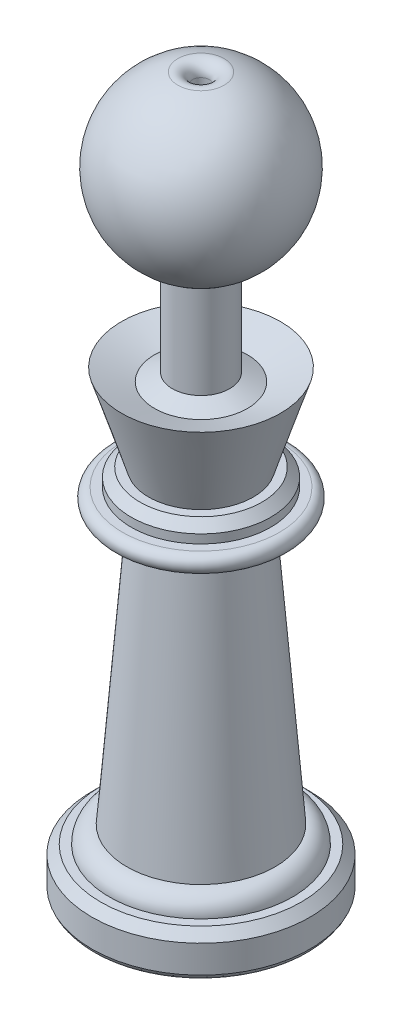
ISO-10303-21;
HEADER;
FILE_DESCRIPTION(('STEP AP214'),'2;1');
FILE_NAME('part.step','',(''),(''),'','','');
FILE_SCHEMA(('AUTOMOTIVE_DESIGN { 1 0 10303 214 1 1 1 1 }'));
ENDSEC;
DATA;
#1=APPLICATION_CONTEXT('core data for automotive mechanical design processes');
#2=APPLICATION_PROTOCOL_DEFINITION('international standard','automotive_design',2000,#1);
#3=PRODUCT_CONTEXT('',#1,'mechanical');
#4=PRODUCT('Part','Part','',(#3));
#5=PRODUCT_RELATED_PRODUCT_CATEGORY('part','',(#4));
#6=PRODUCT_DEFINITION_FORMATION('','',#4);
#7=PRODUCT_DEFINITION_CONTEXT('part definition',#1,'design');
#8=PRODUCT_DEFINITION('design','',#6,#7);
#9=PRODUCT_DEFINITION_SHAPE('','',#8);
#10=(LENGTH_UNIT() NAMED_UNIT(*) SI_UNIT(.MILLI.,.METRE.));
#11=(NAMED_UNIT(*) PLANE_ANGLE_UNIT() SI_UNIT($,.RADIAN.));
#12=(NAMED_UNIT(*) SI_UNIT($,.STERADIAN.) SOLID_ANGLE_UNIT());
#13=UNCERTAINTY_MEASURE_WITH_UNIT(LENGTH_MEASURE(1.E-05),#10,'distance_accuracy_value','');
#14=(GEOMETRIC_REPRESENTATION_CONTEXT(3) GLOBAL_UNCERTAINTY_ASSIGNED_CONTEXT((#13)) GLOBAL_UNIT_ASSIGNED_CONTEXT((#10,
#11,#12)) REPRESENTATION_CONTEXT('',''));
#15=CARTESIAN_POINT('',(0.,0.,0.));
#16=DIRECTION('',(0.,0.,1.));
#17=DIRECTION('',(1.,0.,0.));
#18=AXIS2_PLACEMENT_3D('',#15,#16,#17);
#19=CARTESIAN_POINT('',(0.,62.32,0.));
#20=DIRECTION('',(0.,-1.,0.));
#21=DIRECTION('',(0.,0.,-1.));
#22=AXIS2_PLACEMENT_3D('',#19,#20,#21);
#23=CYLINDRICAL_SURFACE('',#22,0.75);
#24=CARTESIAN_POINT('',(0.,60.6510598246399,0.));
#25=DIRECTION('',(0.,-1.,0.));
#26=DIRECTION('',(0.,0.,-1.));
#27=AXIS2_PLACEMENT_3D('',#24,#25,#26);
#28=CIRCLE('',#27,0.75);
#29=CARTESIAN_POINT('',(0.,60.6510598246399,-0.75));
#30=VERTEX_POINT('',#29);
#31=EDGE_CURVE('E60',#30,#30,#28,.F.);
#32=ORIENTED_EDGE('',*,*,#31,.T.);
#33=EDGE_LOOP('',(#32));
#34=FACE_BOUND('',#33,.T.);
#35=CARTESIAN_POINT('',(0.,1.32,0.));
#36=DIRECTION('',(0.,-1.,0.));
#37=DIRECTION('',(0.,0.,-1.));
#38=AXIS2_PLACEMENT_3D('',#35,#36,#37);
#39=CIRCLE('',#38,0.75);
#40=CARTESIAN_POINT('',(0.,1.32,-0.75));
#41=VERTEX_POINT('',#40);
#42=EDGE_CURVE('E72',#41,#41,#39,.F.);
#43=ORIENTED_EDGE('',*,*,#42,.F.);
#44=EDGE_LOOP('',(#43));
#45=FACE_BOUND('',#44,.T.);
#46=ADVANCED_FACE('F47',(#34,#45),#23,.F.);
#47=CARTESIAN_POINT('',(0.,39.8518731212378,0.));
#48=DIRECTION('',(0.,-1.,0.));
#49=DIRECTION('',(0.,0.,-1.));
#50=AXIS2_PLACEMENT_3D('',#47,#48,#49);
#51=CONICAL_SURFACE('',#50,0.378886856697502,1.14466578861794);
#52=CARTESIAN_POINT('',(0.,38.8890023826898,0.));
#53=DIRECTION('',(0.,-1.,0.));
#54=DIRECTION('',(0.,0.,-1.));
#55=AXIS2_PLACEMENT_3D('',#52,#53,#54);
#56=CIRCLE('',#55,2.5);
#57=CARTESIAN_POINT('',(0.,38.8890023826898,-2.5));
#58=VERTEX_POINT('',#57);
#59=EDGE_CURVE('E78',#58,#58,#56,.T.);
#60=ORIENTED_EDGE('',*,*,#59,.T.);
#61=EDGE_LOOP('',(#60));
#62=FACE_BOUND('',#61,.T.);
#63=CARTESIAN_POINT('',(0.,38.1790309038726,0.));
#64=DIRECTION('',(0.,-1.,0.));
#65=DIRECTION('',(0.,0.,-1.));
#66=AXIS2_PLACEMENT_3D('',#63,#64,#65);
#67=CIRCLE('',#66,4.06400000000001);
#68=CARTESIAN_POINT('',(0.,38.1790309038726,-4.06400000000001));
#69=VERTEX_POINT('',#68);
#70=EDGE_CURVE('E98',#69,#69,#67,.T.);
#71=ORIENTED_EDGE('',*,*,#70,.F.);
#72=EDGE_LOOP('',(#71));
#73=FACE_BOUND('',#72,.T.);
#74=ADVANCED_FACE('F166',(#62,#73),#51,.T.);
#75=CARTESIAN_POINT('',(0.,38.1790309038726,0.));
#76=DIRECTION('',(0.,1.,0.));
#77=DIRECTION('',(0.,0.,1.));
#78=AXIS2_PLACEMENT_3D('',#75,#76,#77);
#79=CONICAL_SURFACE('',#78,4.06400000000001,1.21375917489139);
#80=CARTESIAN_POINT('',(0.,39.2543812972836,0.));
#81=DIRECTION('',(0.,-1.,0.));
#82=DIRECTION('',(0.,0.,-1.));
#83=AXIS2_PLACEMENT_3D('',#80,#81,#82);
#84=CIRCLE('',#83,6.94679152947641);
#85=CARTESIAN_POINT('',(0.,39.2543812972836,-6.94679152947641));
#86=VERTEX_POINT('',#85);
#87=EDGE_CURVE('E102',#86,#86,#84,.T.);
#88=ORIENTED_EDGE('',*,*,#87,.F.);
#89=EDGE_LOOP('',(#88));
#90=FACE_BOUND('',#89,.T.);
#91=ORIENTED_EDGE('',*,*,#70,.T.);
#92=EDGE_LOOP('',(#91));
#93=FACE_BOUND('',#92,.T.);
#94=ADVANCED_FACE('F173',(#90,#93),#79,.F.);
#95=CARTESIAN_POINT('',(0.,39.2543812972836,0.));
#96=DIRECTION('',(0.,1.,0.));
#97=DIRECTION('',(0.,0.,1.));
#98=AXIS2_PLACEMENT_3D('',#95,#96,#97);
#99=CONICAL_SURFACE('',#98,6.94679152947641,0.305512416394749);
#100=CARTESIAN_POINT('',(0.,31.7246,0.));
#101=DIRECTION('',(0.,-1.,0.));
#102=DIRECTION('',(0.,0.,-1.));
#103=AXIS2_PLACEMENT_3D('',#100,#101,#102);
#104=CIRCLE('',#103,4.572);
#105=CARTESIAN_POINT('',(0.,31.7246,-4.572));
#106=VERTEX_POINT('',#105);
#107=EDGE_CURVE('E106',#106,#106,#104,.T.);
#108=ORIENTED_EDGE('',*,*,#107,.F.);
#109=EDGE_LOOP('',(#108));
#110=FACE_BOUND('',#109,.T.);
#111=ORIENTED_EDGE('',*,*,#87,.T.);
#112=EDGE_LOOP('',(#111));
#113=FACE_BOUND('',#112,.T.);
#114=ADVANCED_FACE('F220',(#110,#113),#99,.T.);
#115=CARTESIAN_POINT('',(-6.096,31.7246,0.));
#116=DIRECTION('',(0.,-1.,0.));
#117=DIRECTION('',(0.,0.,-1.));
#118=AXIS2_PLACEMENT_3D('',#115,#116,#117);
#119=PLANE('',#118);
#120=CARTESIAN_POINT('',(0.,31.7246,0.));
#121=DIRECTION('',(0.,-1.,0.));
#122=DIRECTION('',(0.,0.,-1.));
#123=AXIS2_PLACEMENT_3D('',#120,#121,#122);
#124=CIRCLE('',#123,5.334);
#125=CARTESIAN_POINT('',(0.,31.7246,-5.334));
#126=VERTEX_POINT('',#125);
#127=EDGE_CURVE('E71',#126,#126,#124,.F.);
#128=ORIENTED_EDGE('',*,*,#127,.T.);
#129=EDGE_LOOP('',(#128));
#130=FACE_BOUND('',#129,.T.);
#131=ORIENTED_EDGE('',*,*,#107,.T.);
#132=EDGE_LOOP('',(#131));
#133=FACE_BOUND('',#132,.T.);
#134=ADVANCED_FACE('F216',(#130,#133),#119,.F.);
#135=CARTESIAN_POINT('',(0.,0.,0.));
#136=DIRECTION('',(0.,-1.,0.));
#137=DIRECTION('',(0.,0.,-1.));
#138=AXIS2_PLACEMENT_3D('',#135,#136,#137);
#139=CYLINDRICAL_SURFACE('',#138,6.096);
#140=CARTESIAN_POINT('',(0.,30.9626,0.));
#141=DIRECTION('',(0.,-1.,0.));
#142=DIRECTION('',(0.,0.,-1.));
#143=AXIS2_PLACEMENT_3D('',#140,#141,#142);
#144=CIRCLE('',#143,6.096);
#145=CARTESIAN_POINT('',(0.,30.9626,-6.096));
#146=VERTEX_POINT('',#145);
#147=EDGE_CURVE('E86',#146,#146,#144,.T.);
#148=ORIENTED_EDGE('',*,*,#147,.T.);
#149=EDGE_LOOP('',(#148));
#150=FACE_BOUND('',#149,.T.);
#151=CARTESIAN_POINT('',(0.,30.2006,0.));
#152=DIRECTION('',(0.,-1.,0.));
#153=DIRECTION('',(0.,0.,-1.));
#154=AXIS2_PLACEMENT_3D('',#151,#152,#153);
#155=CIRCLE('',#154,6.096);
#156=CARTESIAN_POINT('',(0.,30.2006,-6.096));
#157=VERTEX_POINT('',#156);
#158=EDGE_CURVE('E110',#157,#157,#155,.T.);
#159=ORIENTED_EDGE('',*,*,#158,.F.);
#160=EDGE_LOOP('',(#159));
#161=FACE_BOUND('',#160,.T.);
#162=ADVANCED_FACE('F212',(#150,#161),#139,.T.);
#163=CARTESIAN_POINT('',(-6.858,30.2006,0.));
#164=DIRECTION('',(0.,-1.,0.));
#165=DIRECTION('',(0.,0.,-1.));
#166=AXIS2_PLACEMENT_3D('',#163,#164,#165);
#167=PLANE('',#166);
#168=CARTESIAN_POINT('',(0.,30.2006,0.));
#169=DIRECTION('',(0.,-1.,0.));
#170=DIRECTION('',(0.,0.,-1.));
#171=AXIS2_PLACEMENT_3D('',#168,#169,#170);
#172=CIRCLE('',#171,6.858);
#173=CARTESIAN_POINT('',(0.,30.2006,-6.858));
#174=VERTEX_POINT('',#173);
#175=EDGE_CURVE('E114',#174,#174,#172,.T.);
#176=ORIENTED_EDGE('',*,*,#175,.F.);
#177=EDGE_LOOP('',(#176));
#178=FACE_BOUND('',#177,.T.);
#179=ORIENTED_EDGE('',*,*,#158,.T.);
#180=EDGE_LOOP('',(#179));
#181=FACE_BOUND('',#180,.T.);
#182=ADVANCED_FACE('F208',(#178,#181),#167,.F.);
#183=CARTESIAN_POINT('',(0.,29.4386,0.));
#184=DIRECTION('',(0.,-1.,0.));
#185=DIRECTION('',(0.,0.,-1.));
#186=AXIS2_PLACEMENT_3D('',#183,#184,#185);
#187=TOROIDAL_SURFACE('',#186,6.858,0.761999999999999);
#188=CARTESIAN_POINT('',(0.,28.6766,0.));
#189=DIRECTION('',(0.,-1.,0.));
#190=DIRECTION('',(0.,0.,-1.));
#191=AXIS2_PLACEMENT_3D('',#188,#189,#190);
#192=CIRCLE('',#191,6.858);
#193=CARTESIAN_POINT('',(0.,28.6766,-6.858));
#194=VERTEX_POINT('',#193);
#195=EDGE_CURVE('E118',#194,#194,#192,.T.);
#196=ORIENTED_EDGE('',*,*,#195,.F.);
#197=EDGE_LOOP('',(#196));
#198=FACE_BOUND('',#197,.T.);
#199=ORIENTED_EDGE('',*,*,#175,.T.);
#200=EDGE_LOOP('',(#199));
#201=FACE_BOUND('',#200,.T.);
#202=ADVANCED_FACE('F204',(#198,#201),#187,.T.);
#203=CARTESIAN_POINT('',(-4.572,28.6766,0.));
#204=DIRECTION('',(0.,1.,0.));
#205=DIRECTION('',(0.,0.,1.));
#206=AXIS2_PLACEMENT_3D('',#203,#204,#205);
#207=PLANE('',#206);
#208=CARTESIAN_POINT('',(0.,28.6766,0.));
#209=DIRECTION('',(0.,-1.,0.));
#210=DIRECTION('',(0.,0.,-1.));
#211=AXIS2_PLACEMENT_3D('',#208,#209,#210);
#212=CIRCLE('',#211,4.572);
#213=CARTESIAN_POINT('',(0.,28.6766,-4.572));
#214=VERTEX_POINT('',#213);
#215=EDGE_CURVE('E122',#214,#214,#212,.T.);
#216=ORIENTED_EDGE('',*,*,#215,.F.);
#217=EDGE_LOOP('',(#216));
#218=FACE_BOUND('',#217,.T.);
#219=ORIENTED_EDGE('',*,*,#195,.T.);
#220=EDGE_LOOP('',(#219));
#221=FACE_BOUND('',#220,.T.);
#222=ADVANCED_FACE('F200',(#218,#221),#207,.F.);
#223=CARTESIAN_POINT('',(0.,28.6766,0.));
#224=DIRECTION('',(0.,-1.,0.));
#225=DIRECTION('',(0.,0.,-1.));
#226=AXIS2_PLACEMENT_3D('',#223,#224,#225);
#227=CONICAL_SURFACE('',#226,4.572,0.0792826173458509);
#228=CARTESIAN_POINT('',(0.,4.699,0.));
#229=DIRECTION('',(0.,-1.,0.));
#230=DIRECTION('',(0.,0.,-1.));
#231=AXIS2_PLACEMENT_3D('',#228,#229,#230);
#232=CIRCLE('',#231,6.477);
#233=CARTESIAN_POINT('',(0.,4.699,-6.477));
#234=VERTEX_POINT('',#233);
#235=EDGE_CURVE('E126',#234,#234,#232,.T.);
#236=ORIENTED_EDGE('',*,*,#235,.F.);
#237=EDGE_LOOP('',(#236));
#238=FACE_BOUND('',#237,.T.);
#239=ORIENTED_EDGE('',*,*,#215,.T.);
#240=EDGE_LOOP('',(#239));
#241=FACE_BOUND('',#240,.T.);
#242=ADVANCED_FACE('F196',(#238,#241),#227,.T.);
#243=CARTESIAN_POINT('',(-9.525,3.175,0.));
#244=DIRECTION('',(0.,-1.,0.));
#245=DIRECTION('',(0.,0.,-1.));
#246=AXIS2_PLACEMENT_3D('',#243,#244,#245);
#247=PLANE('',#246);
#248=CARTESIAN_POINT('',(0.,3.175,0.));
#249=DIRECTION('',(0.,-1.,0.));
#250=DIRECTION('',(0.,0.,-1.));
#251=AXIS2_PLACEMENT_3D('',#248,#249,#250);
#252=CIRCLE('',#251,8.763);
#253=CARTESIAN_POINT('',(0.,3.175,-8.763));
#254=VERTEX_POINT('',#253);
#255=EDGE_CURVE('E90',#254,#254,#252,.F.);
#256=ORIENTED_EDGE('',*,*,#255,.T.);
#257=EDGE_LOOP('',(#256));
#258=FACE_BOUND('',#257,.T.);
#259=CARTESIAN_POINT('',(0.,3.175,0.));
#260=DIRECTION('',(0.,-1.,0.));
#261=DIRECTION('',(0.,0.,-1.));
#262=AXIS2_PLACEMENT_3D('',#259,#260,#261);
#263=CIRCLE('',#262,8.001);
#264=CARTESIAN_POINT('',(0.,3.175,-8.001));
#265=VERTEX_POINT('',#264);
#266=EDGE_CURVE('E130',#265,#265,#263,.T.);
#267=ORIENTED_EDGE('',*,*,#266,.T.);
#268=EDGE_LOOP('',(#267));
#269=FACE_BOUND('',#268,.T.);
#270=ADVANCED_FACE('F192',(#258,#269),#247,.F.);
#271=CARTESIAN_POINT('',(0.,0.,0.));
#272=DIRECTION('',(0.,-1.,0.));
#273=DIRECTION('',(0.,0.,-1.));
#274=AXIS2_PLACEMENT_3D('',#271,#272,#273);
#275=CYLINDRICAL_SURFACE('',#274,9.525);
#276=CARTESIAN_POINT('',(0.,2.413,0.));
#277=DIRECTION('',(0.,-1.,0.));
#278=DIRECTION('',(0.,0.,-1.));
#279=AXIS2_PLACEMENT_3D('',#276,#277,#278);
#280=CIRCLE('',#279,9.525);
#281=CARTESIAN_POINT('',(0.,2.413,-9.525));
#282=VERTEX_POINT('',#281);
#283=EDGE_CURVE('E94',#282,#282,#280,.T.);
#284=ORIENTED_EDGE('',*,*,#283,.T.);
#285=EDGE_LOOP('',(#284));
#286=FACE_BOUND('',#285,.T.);
#287=CARTESIAN_POINT('',(0.,0.,0.));
#288=DIRECTION('',(0.,-1.,0.));
#289=DIRECTION('',(0.,0.,-1.));
#290=AXIS2_PLACEMENT_3D('',#287,#288,#289);
#291=CIRCLE('',#290,9.525);
#292=CARTESIAN_POINT('',(0.,0.,-9.525));
#293=VERTEX_POINT('',#292);
#294=EDGE_CURVE('E134',#293,#293,#291,.T.);
#295=ORIENTED_EDGE('',*,*,#294,.F.);
#296=EDGE_LOOP('',(#295));
#297=FACE_BOUND('',#296,.T.);
#298=ADVANCED_FACE('F188',(#286,#297),#275,.T.);
#299=CARTESIAN_POINT('',(0.,3.175,0.));
#300=DIRECTION('',(0.,-1.,0.));
#301=DIRECTION('',(0.,0.,-1.));
#302=AXIS2_PLACEMENT_3D('',#299,#300,#301);
#303=TOROIDAL_SURFACE('',#302,6.477,1.524);
#304=ORIENTED_EDGE('',*,*,#235,.T.);
#305=EDGE_LOOP('',(#304));
#306=FACE_BOUND('',#305,.T.);
#307=ORIENTED_EDGE('',*,*,#266,.F.);
#308=EDGE_LOOP('',(#307));
#309=FACE_BOUND('',#308,.T.);
#310=ADVANCED_FACE('F191',(#306,#309),#303,.T.);
#311=CARTESIAN_POINT('',(0.,2.413,0.));
#312=DIRECTION('',(0.,-1.,0.));
#313=DIRECTION('',(0.,0.,-1.));
#314=AXIS2_PLACEMENT_3D('',#311,#312,#313);
#315=CONICAL_SURFACE('',#314,9.525,0.785398163397451);
#316=ORIENTED_EDGE('',*,*,#255,.F.);
#317=EDGE_LOOP('',(#316));
#318=FACE_BOUND('',#317,.T.);
#319=ORIENTED_EDGE('',*,*,#283,.F.);
#320=EDGE_LOOP('',(#319));
#321=FACE_BOUND('',#320,.T.);
#322=ADVANCED_FACE('F230',(#318,#321),#315,.T.);
#323=CARTESIAN_POINT('',(0.,30.9626,0.));
#324=DIRECTION('',(0.,-1.,0.));
#325=DIRECTION('',(0.,0.,-1.));
#326=AXIS2_PLACEMENT_3D('',#323,#324,#325);
#327=CONICAL_SURFACE('',#326,6.096,0.785398163397449);
#328=ORIENTED_EDGE('',*,*,#127,.F.);
#329=EDGE_LOOP('',(#328));
#330=FACE_BOUND('',#329,.T.);
#331=ORIENTED_EDGE('',*,*,#147,.F.);
#332=EDGE_LOOP('',(#331));
#333=FACE_BOUND('',#332,.T.);
#334=ADVANCED_FACE('F187',(#330,#333),#327,.T.);
#335=CARTESIAN_POINT('',(0.,0.,0.));
#336=DIRECTION('',(0.,1.,0.));
#337=DIRECTION('',(0.,0.,1.));
#338=AXIS2_PLACEMENT_3D('',#335,#336,#337);
#339=CONICAL_SURFACE('',#338,10.,1.04608569775846);
#340=CARTESIAN_POINT('',(0.,-0.530331233142372,0.));
#341=DIRECTION('',(0.,-1.,0.));
#342=DIRECTION('',(0.,0.,-1.));
#343=AXIS2_PLACEMENT_3D('',#340,#341,#342);
#344=CIRCLE('',#343,9.08379342931001);
#345=CARTESIAN_POINT('',(0.,-0.530331233142372,-9.08379342931001));
#346=VERTEX_POINT('',#345);
#347=EDGE_CURVE('E55',#346,#346,#344,.T.);
#348=ORIENTED_EDGE('',*,*,#347,.T.);
#349=EDGE_LOOP('',(#348));
#350=FACE_BOUND('',#349,.T.);
#351=CARTESIAN_POINT('',(0.,-2.68,0.));
#352=DIRECTION('',(0.,-1.,0.));
#353=DIRECTION('',(0.,0.,-1.));
#354=AXIS2_PLACEMENT_3D('',#351,#352,#353);
#355=CIRCLE('',#354,5.37);
#356=CARTESIAN_POINT('',(0.,-2.68,-5.37));
#357=VERTEX_POINT('',#356);
#358=EDGE_CURVE('E82',#357,#357,#355,.T.);
#359=ORIENTED_EDGE('',*,*,#358,.F.);
#360=EDGE_LOOP('',(#359));
#361=FACE_BOUND('',#360,.T.);
#362=ADVANCED_FACE('F181',(#350,#361),#339,.T.);
#363=CARTESIAN_POINT('',(0.,37.6610175450428,0.));
#364=DIRECTION('',(0.,-1.,0.));
#365=DIRECTION('',(0.,0.,-1.));
#366=AXIS2_PLACEMENT_3D('',#363,#364,#365);
#367=CYLINDRICAL_SURFACE('',#366,2.5);
#368=CARTESIAN_POINT('',(0.,47.32,0.));
#369=DIRECTION('',(0.,1.,0.));
#370=DIRECTION('',(0.,0.,1.));
#371=AXIS2_PLACEMENT_3D('',#368,#369,#370);
#372=CIRCLE('',#371,2.5);
#373=CARTESIAN_POINT('',(-2.49999999999998,47.32,0.));
#374=VERTEX_POINT('',#373);
#375=EDGE_CURVE('E76',#374,#374,#372,.T.);
#376=ORIENTED_EDGE('',*,*,#375,.F.);
#377=EDGE_LOOP('',(#376));
#378=FACE_BOUND('',#377,.T.);
#379=ORIENTED_EDGE('',*,*,#59,.F.);
#380=EDGE_LOOP('',(#379));
#381=FACE_BOUND('',#380,.T.);
#382=ADVANCED_FACE('F178',(#378,#381),#367,.T.);
#383=CARTESIAN_POINT('',(0.,54.3910678118655,0.));
#384=DIRECTION('',(0.,-1.,0.));
#385=DIRECTION('',(-1.,0.,0.));
#386=AXIS2_PLACEMENT_3D('',#383,#384,#385);
#387=SPHERICAL_SURFACE('',#386,7.5);
#388=CARTESIAN_POINT('',(0.,61.6141355189129,0.));
#389=DIRECTION('',(0.,-1.,0.));
#390=DIRECTION('',(0.,0.,-1.));
#391=AXIS2_PLACEMENT_3D('',#388,#389,#390);
#392=CIRCLE('',#391,2.01923076923077);
#393=CARTESIAN_POINT('',(-2.01923076923076,61.6141355189129,0.));
#394=VERTEX_POINT('',#393);
#395=EDGE_CURVE('E65',#394,#394,#392,.T.);
#396=CARTESIAN_POINT('',(-2.01923076923076,61.6141355189129,0.));
#397=CARTESIAN_POINT('',(-2.20953160429818,61.5609544672999,0.));
#398=CARTESIAN_POINT('',(-2.39771862783332,61.5002209168937,0.));
#399=CARTESIAN_POINT('',(-2.76871658126349,61.3641001632998,0.));
#400=CARTESIAN_POINT('',(-2.95152751115852,61.2887129601122,0.));
#401=CARTESIAN_POINT('',(-3.31062480673288,61.1237362457608,0.));
#402=CARTESIAN_POINT('',(-3.48691117241222,61.0341467345971,0.));
#403=CARTESIAN_POINT('',(-3.83186059886484,60.8413299356337,0.));
#404=CARTESIAN_POINT('',(-4.00052365963812,60.7381026478342,0.));
#405=CARTESIAN_POINT('',(-4.32917292168087,60.5186534055196,0.));
#406=CARTESIAN_POINT('',(-4.48915912295034,60.4024314510046,0.));
#407=CARTESIAN_POINT('',(-4.79945593096219,60.1577188772608,0.));
#408=CARTESIAN_POINT('',(-4.94976653770458,60.0292282580319,0.));
#409=CARTESIAN_POINT('',(-5.23977365804739,59.7607804844788,0.));
#410=CARTESIAN_POINT('',(-5.37947017164782,59.6208233301546,0.));
#411=CARTESIAN_POINT('',(-5.64737692238682,59.3303163335391,0.));
#412=CARTESIAN_POINT('',(-5.7755871595254,59.1797664912479,0.));
#413=CARTESIAN_POINT('',(-6.01972087599557,58.8690140672572,0.));
#414=CARTESIAN_POINT('',(-6.13564435532717,58.7088114855578,0.));
#415=CARTESIAN_POINT('',(-6.35448079035756,58.3797538071184,0.));
#416=CARTESIAN_POINT('',(-6.45739374605634,58.2108987103784,0.));
#417=CARTESIAN_POINT('',(-6.64956659811533,57.865590245644,0.));
#418=CARTESIAN_POINT('',(-6.73882649447552,57.6891368776496,0.));
#419=CARTESIAN_POINT('',(-6.90313593506462,57.3297335545381,0.));
#420=CARTESIAN_POINT('',(-6.97818547929354,57.146783599421,0.));
#421=CARTESIAN_POINT('',(-7.11360564488678,56.7755293473672,0.));
#422=CARTESIAN_POINT('',(-7.17397626625112,56.5872250504305,0.));
#423=CARTESIAN_POINT('',(-7.27966166303694,56.206437789841,0.));
#424=CARTESIAN_POINT('',(-7.32497643845844,56.0139548261882,0.));
#425=CARTESIAN_POINT('',(-7.40026722122726,55.6260119967017,0.));
#426=CARTESIAN_POINT('',(-7.43024322857459,55.4305521308679,0.));
#427=CARTESIAN_POINT('',(-7.47466932043667,55.0378758478023,0.));
#428=CARTESIAN_POINT('',(-7.48911940495143,54.8406594305706,0.));
#429=CARTESIAN_POINT('',(-7.50240343225927,54.4457013624942,0.));
#430=CARTESIAN_POINT('',(-7.50123737505235,54.2479597116495,0.));
#431=CARTESIAN_POINT('',(-7.48329639917787,53.8531857734203,0.));
#432=CARTESIAN_POINT('',(-7.4665214805103,53.6561534860359,0.));
#433=CARTESIAN_POINT('',(-7.41746751567089,53.264028442901,0.));
#434=CARTESIAN_POINT('',(-7.38518846949904,53.0689356871506,0.));
#435=CARTESIAN_POINT('',(-7.30532778339973,52.6819077660173,0.));
#436=CARTESIAN_POINT('',(-7.25774614347227,52.4899726006343,0.));
#437=CARTESIAN_POINT('',(-7.14757734512283,52.1104582046128,0.));
#438=CARTESIAN_POINT('',(-7.08499018670085,51.9228789739743,0.));
#439=CARTESIAN_POINT('',(-6.94520111337659,51.5532475955587,0.));
#440=CARTESIAN_POINT('',(-6.86799919847431,51.3711954477816,0.));
#441=CARTESIAN_POINT('',(-6.69946262114405,51.013754875116,0.));
#442=CARTESIAN_POINT('',(-6.60812795871607,50.8383664502274,0.));
#443=CARTESIAN_POINT('',(-6.41189613317145,50.4953483578764,0.));
#444=CARTESIAN_POINT('',(-6.3069989700548,50.3277186904139,0.));
#445=CARTESIAN_POINT('',(-6.08429706618917,50.0012647081312,0.));
#446=CARTESIAN_POINT('',(-5.96649232544018,49.8424403933109,0.));
#447=CARTESIAN_POINT('',(-5.718710781567,49.534588726611,0.));
#448=CARTESIAN_POINT('',(-5.5887339784428,49.3855613747314,0.));
#449=CARTESIAN_POINT('',(-5.31741980649825,49.0982341099667,0.));
#450=CARTESIAN_POINT('',(-5.1760824376779,48.9599341970816,0.));
#451=CARTESIAN_POINT('',(-4.88292961529152,48.6949251867865,0.));
#452=CARTESIAN_POINT('',(-4.7311141617255,48.5682160893765,0.));
#453=CARTESIAN_POINT('',(-4.41795286624511,48.3271801783451,0.));
#454=CARTESIAN_POINT('',(-4.25660702433074,48.2128533647238,0.));
#455=CARTESIAN_POINT('',(-3.92539291392364,47.9972944682716,0.));
#456=CARTESIAN_POINT('',(-3.75552464543092,47.8960623854407,0.));
#457=CARTESIAN_POINT('',(-3.40832400746608,47.7073300327192,0.));
#458=CARTESIAN_POINT('',(-3.23099163799398,47.6198297628285,0.));
#459=CARTESIAN_POINT('',(-2.86997834640095,47.4590885288482,0.));
#460=CARTESIAN_POINT('',(-2.68629742428003,47.3858475647586,0.));
#461=CARTESIAN_POINT('',(-2.49999999999998,47.32,0.));
#462=B_SPLINE_CURVE_WITH_KNOTS('',3,(#396,#397,#398,#399,#400,#401,#402,#403,#404,#405,#406,
#407,#408,#409,#410,#411,#412,#413,#414,#415,#416,#417,#418,#419,#420,#421,#422,#423,#424,#425,
#426,#427,#428,#429,#430,#431,#432,#433,#434,#435,#436,#437,#438,#439,#440,#441,#442,#443,#444,
#445,#446,#447,#448,#449,#450,#451,#452,#453,#454,#455,#456,#457,#458,#459,#460,#461),
.UNSPECIFIED.,.F.,.F.,(4,2,2,2,2,2,2,2,2,2,2,2,2,2,2,2,2,2,2,2,2,2,2,2,2,2,2,2,2,2,2,2,4),(0.,
0.592617957310406,1.18523591462082,1.77785387193122,2.37047182924163,2.96308978655204,
3.55570774386245,4.14832570117285,4.74094365848326,5.33356161579367,5.92617957310407,
6.51879753041448,7.11141548772489,7.7040334450353,8.29665140234571,8.88926935965612,
9.48188731696653,10.0745052742769,10.6671232315873,11.2597411888977,11.8523591462082,
12.4449771035186,13.037595060829,13.6302130181394,14.2228309754498,14.8154489327602,
15.4080668900706,16.000684847381,16.5933028046914,17.1859207620018,17.7785387193122,
18.3711566766226,18.963774633933),.UNSPECIFIED.);
#463=EDGE_CURVE('BSEAM162',#394,#374,#462,.T.);
#464=ORIENTED_EDGE('',*,*,#395,.T.);
#465=ORIENTED_EDGE('',*,*,#375,.T.);
#466=ORIENTED_EDGE('',*,*,#463,.T.);
#467=ORIENTED_EDGE('',*,*,#463,.F.);
#468=EDGE_LOOP('',(#464,#466,#465,#467));
#469=FACE_BOUND('',#468,.T.);
#470=ADVANCED_FACE('F162',(#469),#387,.T.);
#471=CARTESIAN_POINT('',(0.,1.32,0.));
#472=DIRECTION('',(0.,-1.,0.));
#473=DIRECTION('',(0.,0.,-1.));
#474=AXIS2_PLACEMENT_3D('',#471,#472,#473);
#475=PLANE('',#474);
#476=CARTESIAN_POINT('',(0.,1.32,0.));
#477=DIRECTION('',(0.,-1.,0.));
#478=DIRECTION('',(0.,0.,-1.));
#479=AXIS2_PLACEMENT_3D('',#476,#477,#478);
#480=CIRCLE('',#479,5.1);
#481=CARTESIAN_POINT('',(0.,1.32,-5.1));
#482=VERTEX_POINT('',#481);
#483=EDGE_CURVE('E77',#482,#482,#480,.T.);
#484=ORIENTED_EDGE('',*,*,#483,.T.);
#485=EDGE_LOOP('',(#484));
#486=FACE_BOUND('',#485,.T.);
#487=ORIENTED_EDGE('',*,*,#42,.T.);
#488=EDGE_LOOP('',(#487));
#489=FACE_BOUND('',#488,.T.);
#490=ADVANCED_FACE('F148',(#486,#489),#475,.T.);
#491=CARTESIAN_POINT('',(0.,1.32,0.));
#492=DIRECTION('',(0.,-1.,0.));
#493=DIRECTION('',(0.,0.,-1.));
#494=AXIS2_PLACEMENT_3D('',#491,#492,#493);
#495=CYLINDRICAL_SURFACE('',#494,5.1);
#496=CARTESIAN_POINT('',(0.,-1.99655285500633,0.));
#497=DIRECTION('',(0.,-1.,0.));
#498=DIRECTION('',(0.,0.,-1.));
#499=AXIS2_PLACEMENT_3D('',#496,#497,#498);
#500=CIRCLE('',#499,5.1);
#501=CARTESIAN_POINT('',(0.,-1.99655285500633,-5.1));
#502=VERTEX_POINT('',#501);
#503=EDGE_CURVE('E10',#502,#502,#500,.T.);
#504=ORIENTED_EDGE('',*,*,#503,.T.);
#505=EDGE_LOOP('',(#504));
#506=FACE_BOUND('',#505,.T.);
#507=ORIENTED_EDGE('',*,*,#483,.F.);
#508=EDGE_LOOP('',(#507));
#509=FACE_BOUND('',#508,.T.);
#510=ADVANCED_FACE('F151',(#506,#509),#495,.F.);
#511=CARTESIAN_POINT('',(0.,60.6510598246399,0.));
#512=DIRECTION('',(0.,-1.,0.));
#513=DIRECTION('',(0.,0.,-1.));
#514=AXIS2_PLACEMENT_3D('',#511,#512,#513);
#515=TOROIDAL_SURFACE('',#514,1.75,1.);
#516=ORIENTED_EDGE('',*,*,#31,.F.);
#517=EDGE_LOOP('',(#516));
#518=FACE_BOUND('',#517,.T.);
#519=ORIENTED_EDGE('',*,*,#395,.F.);
#520=EDGE_LOOP('',(#519));
#521=FACE_BOUND('',#520,.T.);
#522=ADVANCED_FACE('F153',(#518,#521),#515,.T.);
#523=CARTESIAN_POINT('',(0.,0.335137708739469,0.));
#524=DIRECTION('',(0.,1.,0.));
#525=DIRECTION('',(0.,0.,1.));
#526=AXIS2_PLACEMENT_3D('',#523,#524,#525);
#527=TOROIDAL_SURFACE('',#526,8.58283084524017,1.);
#528=ORIENTED_EDGE('',*,*,#294,.T.);
#529=EDGE_LOOP('',(#528));
#530=FACE_BOUND('',#529,.T.);
#531=ORIENTED_EDGE('',*,*,#347,.F.);
#532=EDGE_LOOP('',(#531));
#533=FACE_BOUND('',#532,.T.);
#534=ADVANCED_FACE('F159',(#530,#533),#527,.T.);
#535=CARTESIAN_POINT('',(0.,-1.99655285500633,0.));
#536=DIRECTION('',(0.,-1.,0.));
#537=DIRECTION('',(0.,0.,-1.));
#538=AXIS2_PLACEMENT_3D('',#535,#536,#537);
#539=TOROIDAL_SURFACE('',#538,6.1,1.);
#540=ORIENTED_EDGE('',*,*,#358,.T.);
#541=EDGE_LOOP('',(#540));
#542=FACE_BOUND('',#541,.T.);
#543=ORIENTED_EDGE('',*,*,#503,.F.);
#544=EDGE_LOOP('',(#543));
#545=FACE_BOUND('',#544,.T.);
#546=ADVANCED_FACE('F49',(#542,#545),#539,.T.);
#547=CLOSED_SHELL('',(#46,#74,#94,#114,#134,#162,#182,#202,#222,#242,#270,#298,#310,#322,#334,
#362,#382,#470,#490,#510,#522,#534,#546));
#548=MANIFOLD_SOLID_BREP('B2',#547);
#549=ADVANCED_BREP_SHAPE_REPRESENTATION('',(#18,#548),#14);
#550=SHAPE_DEFINITION_REPRESENTATION(#9,#549);
ENDSEC;
END-ISO-10303-21;
